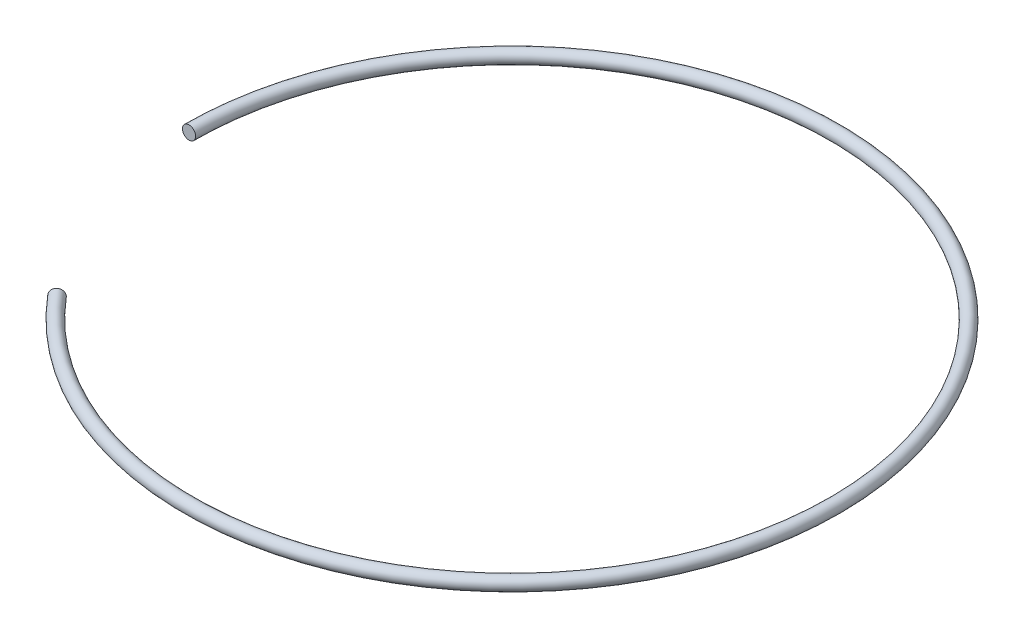
ISO-10303-21;
HEADER;
FILE_DESCRIPTION(('STEP AP214'),'2;1');
FILE_NAME('part.step','',(''),(''),'','','');
FILE_SCHEMA(('AUTOMOTIVE_DESIGN { 1 0 10303 214 1 1 1 1 }'));
ENDSEC;
DATA;
#1=APPLICATION_CONTEXT('core data for automotive mechanical design processes');
#2=APPLICATION_PROTOCOL_DEFINITION('international standard','automotive_design',2000,#1);
#3=PRODUCT_CONTEXT('',#1,'mechanical');
#4=PRODUCT('Part','Part','',(#3));
#5=PRODUCT_RELATED_PRODUCT_CATEGORY('part','',(#4));
#6=PRODUCT_DEFINITION_FORMATION('','',#4);
#7=PRODUCT_DEFINITION_CONTEXT('part definition',#1,'design');
#8=PRODUCT_DEFINITION('design','',#6,#7);
#9=PRODUCT_DEFINITION_SHAPE('','',#8);
#10=(LENGTH_UNIT() NAMED_UNIT(*) SI_UNIT(.MILLI.,.METRE.));
#11=(NAMED_UNIT(*) PLANE_ANGLE_UNIT() SI_UNIT($,.RADIAN.));
#12=(NAMED_UNIT(*) SI_UNIT($,.STERADIAN.) SOLID_ANGLE_UNIT());
#13=UNCERTAINTY_MEASURE_WITH_UNIT(LENGTH_MEASURE(1.E-05),#10,'distance_accuracy_value','');
#14=(GEOMETRIC_REPRESENTATION_CONTEXT(3) GLOBAL_UNCERTAINTY_ASSIGNED_CONTEXT((#13)) GLOBAL_UNIT_ASSIGNED_CONTEXT((#10,
#11,#12)) REPRESENTATION_CONTEXT('',''));
#15=CARTESIAN_POINT('',(0.,0.,0.));
#16=DIRECTION('',(0.,0.,1.));
#17=DIRECTION('',(1.,0.,0.));
#18=AXIS2_PLACEMENT_3D('',#15,#16,#17);
#19=CARTESIAN_POINT('',(-6.2,4.5222,0.));
#20=DIRECTION('',(0.,0.,1.));
#21=DIRECTION('',(1.,0.,0.));
#22=AXIS2_PLACEMENT_3D('',#19,#20,#21);
#23=PLANE('',#22);
#24=CARTESIAN_POINT('',(-6.327,4.5222,0.));
#25=CARTESIAN_POINT('',(-6.32699100007304,4.53643035707391,0.));
#26=CARTESIAN_POINT('',(-6.32456550768693,4.55074828029162,0.));
#27=CARTESIAN_POINT('',(-6.31511620570525,4.57772713981076,0.));
#28=CARTESIAN_POINT('',(-6.30809239610969,4.59038807611218,0.));
#29=CARTESIAN_POINT('',(-6.29024873565866,4.6126838982527,0.));
#30=CARTESIAN_POINT('',(-6.2794288848031,4.62231878409172,0.));
#31=CARTESIAN_POINT('',(-6.25521020730236,4.63746068307499,0.));
#32=CARTESIAN_POINT('',(-6.24181138065716,4.64296769621925,0.));
#33=CARTESIAN_POINT('',(-6.21394613549006,4.64923686264336,0.));
#34=CARTESIAN_POINT('',(-6.19947971696815,4.64999901592321,0.));
#35=CARTESIAN_POINT('',(-6.17110998623835,4.64669255040931,0.));
#36=CARTESIAN_POINT('',(-6.15720667403046,4.64262393161555,0.));
#37=CARTESIAN_POINT('',(-6.13153100409934,4.63011068190603,0.));
#38=CARTESIAN_POINT('',(-6.1197586463761,4.62166605099026,0.));
#39=CARTESIAN_POINT('',(-6.09967098945865,4.60136861413728,0.));
#40=CARTESIAN_POINT('',(-6.09135569026443,4.58951580820007,0.));
#41=CARTESIAN_POINT('',(-6.07912384207156,4.5636792051199,0.));
#42=CARTESIAN_POINT('',(-6.0752072930729,4.54969540797693,0.));
#43=CARTESIAN_POINT('',(-6.07323166976236,4.53111030553464,0.));
#44=CARTESIAN_POINT('',(-6.07299717963884,4.52665945246293,0.));
#45=CARTESIAN_POINT('',(-6.07300899992696,4.50796964292609,0.));
#46=CARTESIAN_POINT('',(-6.07543449231307,4.49365171970838,0.));
#47=CARTESIAN_POINT('',(-6.08488379429475,4.46667286018924,0.));
#48=CARTESIAN_POINT('',(-6.09190760389031,4.45401192388782,0.));
#49=CARTESIAN_POINT('',(-6.10975126434134,4.4317161017473,0.));
#50=CARTESIAN_POINT('',(-6.1205711151969,4.42208121590828,0.));
#51=CARTESIAN_POINT('',(-6.14478979269764,4.40693931692501,0.));
#52=CARTESIAN_POINT('',(-6.15818861934284,4.40143230378075,0.));
#53=CARTESIAN_POINT('',(-6.18605386450994,4.39516313735664,0.));
#54=CARTESIAN_POINT('',(-6.20052028303185,4.39440098407679,0.));
#55=CARTESIAN_POINT('',(-6.22889001376165,4.39770744959069,0.));
#56=CARTESIAN_POINT('',(-6.24279332596954,4.40177606838445,0.));
#57=CARTESIAN_POINT('',(-6.26846899590067,4.41428931809397,0.));
#58=CARTESIAN_POINT('',(-6.2802413536239,4.42273394900974,0.));
#59=CARTESIAN_POINT('',(-6.30032901054135,4.44303138586272,0.));
#60=CARTESIAN_POINT('',(-6.30864430973557,4.45488419179993,0.));
#61=CARTESIAN_POINT('',(-6.32087615792844,4.4807207948801,0.));
#62=CARTESIAN_POINT('',(-6.3247927069271,4.49470459202306,0.));
#63=CARTESIAN_POINT('',(-6.32676833023764,4.51328969446536,0.));
#64=CARTESIAN_POINT('',(-6.32700282036117,4.51774054753707,0.));
#65=CARTESIAN_POINT('',(-6.327,4.5222,0.));
#66=B_SPLINE_CURVE_WITH_KNOTS('',3,(#24,#25,#26,#27,#28,#29,#30,#31,#32,#33,#34,#35,#36,#37,#38,
#39,#40,#41,#42,#43,#44,#45,#46,#47,#48,#49,#50,#51,#52,#53,#54,#55,#56,#57,#58,#59,#60,#61,#62,
#63,#64,#65),.UNSPECIFIED.,.T.,.F.,(4,2,2,2,2,2,2,2,2,2,2,2,2,2,2,2,2,2,2,2,4),(0.,
0.0426429642402329,0.0852859284804665,0.127928892721775,0.170571856963083,0.213214821204392,
0.255857785445701,0.298500749687009,0.341143713928318,0.383786678169628,0.397149959984687,
0.439792924224919,0.482435888465151,0.52507885270646,0.567721816947769,0.610364781189079,
0.653007745430388,0.695650709671697,0.738293673913005,0.780936638154315,0.794299919969375),.UNSPECIFIED.);
#67=CARTESIAN_POINT('',(-6.327,4.5222,0.));
#68=VERTEX_POINT('',#67);
#69=EDGE_CURVE('E19',#68,#68,#66,.T.);
#70=ORIENTED_EDGE('',*,*,#69,.F.);
#71=EDGE_LOOP('',(#70));
#72=FACE_BOUND('',#71,.T.);
#73=ADVANCED_FACE('F15',(#72),#23,.T.);
#74=CARTESIAN_POINT('',(-4.749475547338,4.5222,3.985283180056));
#75=DIRECTION('',(0.642787609686505,0.,0.766044443119007));
#76=DIRECTION('',(0.766044443119007,0.,-0.642787609686505));
#77=AXIS2_PLACEMENT_3D('',#74,#75,#76);
#78=PLANE('',#77);
#79=CARTESIAN_POINT('',(-4.84676319161418,4.5222,4.06691720648625));
#80=CARTESIAN_POINT('',(-4.84675629727015,4.50796964292609,4.06691142144471));
#81=CARTESIAN_POINT('',(-4.84489826230594,4.49365171970838,4.06535234499152));
#82=CARTESIAN_POINT('',(-4.83765967703152,4.46667286018924,4.05927845075751));
#83=CARTESIAN_POINT('',(-4.83227912672132,4.45401192388782,4.05476363297669));
#84=CARTESIAN_POINT('',(-4.8186100897879,4.4317161017473,4.04329394912732));
#85=CARTESIAN_POINT('',(-4.81032160316463,4.42208121590828,4.03633908305871));
#86=CARTESIAN_POINT('',(-4.79176901984549,4.40693931692501,4.02077161723824));
#87=CARTESIAN_POINT('',(-4.78150492314963,4.40143230378075,4.01215901748637));
#88=CARTESIAN_POINT('',(-4.76015890693322,4.39516313735664,3.99424758315207));
#89=CARTESIAN_POINT('',(-4.74907698741267,4.39440098407679,3.98494874856965));
#90=CARTESIAN_POINT('',(-4.72734451283432,4.39770744959069,3.9667130371664));
#91=CARTESIAN_POINT('',(-4.71669395777652,4.40177606838445,3.95777616034557));
#92=CARTESIAN_POINT('',(-4.69702525350243,4.41428931809397,3.94127215784344));
#93=CARTESIAN_POINT('',(-4.68800710428614,4.42273394900974,3.93370503216214));
#94=CARTESIAN_POINT('',(-4.67261906632924,4.44303138586272,3.92079293518797));
#95=CARTESIAN_POINT('',(-4.66624917758864,4.45488419179993,3.91544796389509));
#96=CARTESIAN_POINT('',(-4.65687903825141,4.4807207948801,3.90758548343315));
#97=CARTESIAN_POINT('',(-4.65387878765478,4.49470459202307,3.90506797426408));
#98=CARTESIAN_POINT('',(-4.65236537239605,4.51328969446536,3.90379806807866));
#99=CARTESIAN_POINT('',(-4.65218574253996,4.51774054753707,3.90364734073266));
#100=CARTESIAN_POINT('',(-4.65219479740599,4.53643035707391,3.90365493866741));
#101=CARTESIAN_POINT('',(-4.6540528323702,4.55074828029162,3.90521401512059));
#102=CARTESIAN_POINT('',(-4.66129141764462,4.57772713981076,3.9112879093546));
#103=CARTESIAN_POINT('',(-4.66667196795483,4.59038807611218,3.91580272713543));
#104=CARTESIAN_POINT('',(-4.68034100488824,4.6126838982527,3.9272724109848));
#105=CARTESIAN_POINT('',(-4.68862949151152,4.62231878409172,3.9342272770534));
#106=CARTESIAN_POINT('',(-4.70718207483066,4.63746068307499,3.94979474287388));
#107=CARTESIAN_POINT('',(-4.71744617152652,4.64296769621925,3.95840734262575));
#108=CARTESIAN_POINT('',(-4.73879218774293,4.64923686264336,3.97631877696004));
#109=CARTESIAN_POINT('',(-4.74987410726347,4.64999901592321,3.98561761154246));
#110=CARTESIAN_POINT('',(-4.77160658184182,4.64669255040931,4.00385332294572));
#111=CARTESIAN_POINT('',(-4.78225713689962,4.64262393161555,4.01279019976656));
#112=CARTESIAN_POINT('',(-4.80192584117371,4.63011068190603,4.02929420226869));
#113=CARTESIAN_POINT('',(-4.81094399039001,4.62166605099026,4.03686132794998));
#114=CARTESIAN_POINT('',(-4.82633202834691,4.60136861413728,4.04977342492414));
#115=CARTESIAN_POINT('',(-4.83270191708751,4.58951580820007,4.05511839621702));
#116=CARTESIAN_POINT('',(-4.84207205642473,4.5636792051199,4.06298087667897));
#117=CARTESIAN_POINT('',(-4.84507230702136,4.54969540797693,4.06549838584804));
#118=CARTESIAN_POINT('',(-4.84658572228008,4.53111030553464,4.06676829203346));
#119=CARTESIAN_POINT('',(-4.84676535213618,4.52665945246293,4.06691901937946));
#120=CARTESIAN_POINT('',(-4.84676319161418,4.5222,4.06691720648625));
#121=B_SPLINE_CURVE_WITH_KNOTS('',3,(#79,#80,#81,#82,#83,#84,#85,#86,#87,#88,#89,#90,#91,#92,
#93,#94,#95,#96,#97,#98,#99,#100,#101,#102,#103,#104,#105,#106,#107,#108,#109,#110,#111,#112,
#113,#114,#115,#116,#117,#118,#119,#120),.UNSPECIFIED.,.T.,.F.,(4,2,2,2,2,2,2,2,2,2,2,2,2,2,2,2,
2,2,2,2,4),(0.,0.042642964240234,0.0852859284804665,0.127928892721775,0.170571856963084,
0.213214821204393,0.255857785445701,0.298500749687011,0.341143713928319,0.383786678169628,
0.397149959984687,0.439792924224921,0.482435888465154,0.525078852706462,0.567721816947771,
0.610364781189079,0.65300774543039,0.695650709671699,0.738293673913007,0.780936638154315,
0.794299919969374),.UNSPECIFIED.);
#122=CARTESIAN_POINT('',(-4.84676319161418,4.5222,4.06691720648625));
#123=VERTEX_POINT('',#122);
#124=EDGE_CURVE('E10',#123,#123,#121,.T.);
#125=ORIENTED_EDGE('',*,*,#124,.F.);
#126=EDGE_LOOP('',(#125));
#127=FACE_BOUND('',#126,.T.);
#128=ADVANCED_FACE('F33',(#127),#78,.F.);
#129=CARTESIAN_POINT('',(0.,4.5222,0.));
#130=DIRECTION('',(0.,1.,0.));
#131=DIRECTION('',(0.,0.,1.));
#132=AXIS2_PLACEMENT_3D('',#129,#130,#131);
#133=TOROIDAL_SURFACE('',#132,6.2,0.127);
#134=ORIENTED_EDGE('',*,*,#69,.T.);
#135=EDGE_LOOP('',(#134));
#136=FACE_BOUND('',#135,.T.);
#137=ORIENTED_EDGE('',*,*,#124,.T.);
#138=EDGE_LOOP('',(#137));
#139=FACE_BOUND('',#138,.T.);
#140=ADVANCED_FACE('F35',(#136,#139),#133,.T.);
#141=CLOSED_SHELL('',(#73,#128,#140));
#142=MANIFOLD_SOLID_BREP('B1',#141);
#143=ADVANCED_BREP_SHAPE_REPRESENTATION('',(#18,#142),#14);
#144=SHAPE_DEFINITION_REPRESENTATION(#9,#143);
ENDSEC;
END-ISO-10303-21;
